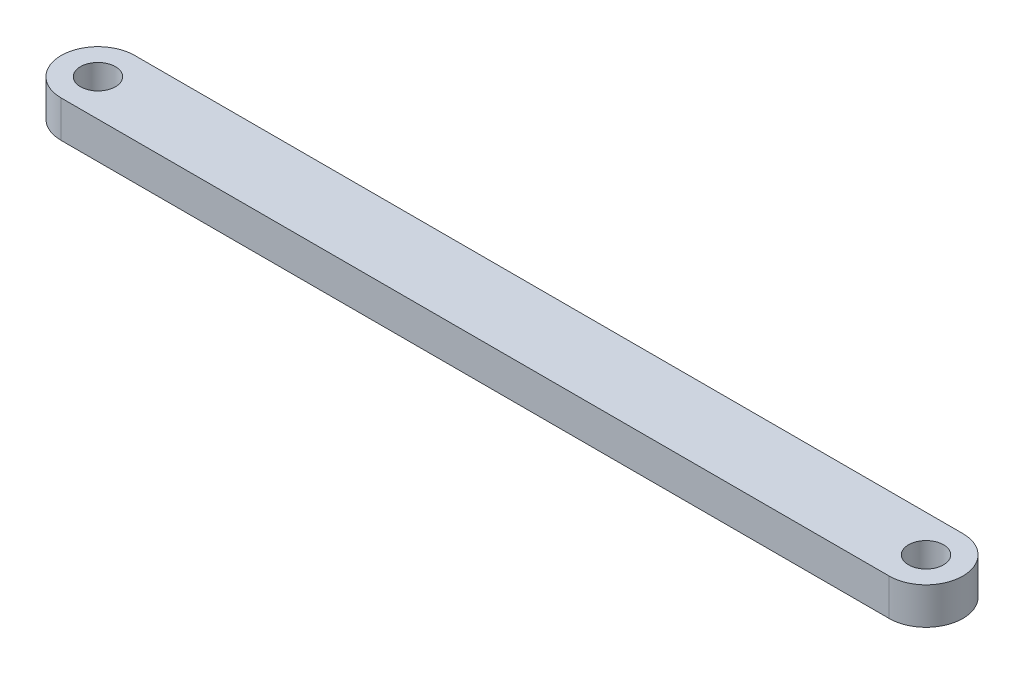
ISO-10303-21;
HEADER;
FILE_DESCRIPTION(('STEP AP214'),'2;1');
FILE_NAME('part.step','',(''),(''),'','','');
FILE_SCHEMA(('AUTOMOTIVE_DESIGN { 1 0 10303 214 1 1 1 1 }'));
ENDSEC;
DATA;
#1=APPLICATION_CONTEXT('core data for automotive mechanical design processes');
#2=APPLICATION_PROTOCOL_DEFINITION('international standard','automotive_design',2000,#1);
#3=PRODUCT_CONTEXT('',#1,'mechanical');
#4=PRODUCT('Part','Part','',(#3));
#5=PRODUCT_RELATED_PRODUCT_CATEGORY('part','',(#4));
#6=PRODUCT_DEFINITION_FORMATION('','',#4);
#7=PRODUCT_DEFINITION_CONTEXT('part definition',#1,'design');
#8=PRODUCT_DEFINITION('design','',#6,#7);
#9=PRODUCT_DEFINITION_SHAPE('','',#8);
#10=(LENGTH_UNIT() NAMED_UNIT(*) SI_UNIT(.MILLI.,.METRE.));
#11=(NAMED_UNIT(*) PLANE_ANGLE_UNIT() SI_UNIT($,.RADIAN.));
#12=(NAMED_UNIT(*) SI_UNIT($,.STERADIAN.) SOLID_ANGLE_UNIT());
#13=UNCERTAINTY_MEASURE_WITH_UNIT(LENGTH_MEASURE(1.E-05),#10,'distance_accuracy_value','');
#14=(GEOMETRIC_REPRESENTATION_CONTEXT(3) GLOBAL_UNCERTAINTY_ASSIGNED_CONTEXT((#13)) GLOBAL_UNIT_ASSIGNED_CONTEXT((#10,
#11,#12)) REPRESENTATION_CONTEXT('',''));
#15=CARTESIAN_POINT('',(0.,0.,0.));
#16=DIRECTION('',(0.,0.,1.));
#17=DIRECTION('',(1.,0.,0.));
#18=AXIS2_PLACEMENT_3D('',#15,#16,#17);
#19=CARTESIAN_POINT('',(22.5,1.,0.));
#20=DIRECTION('',(0.,1.,0.));
#21=DIRECTION('',(0.,0.,1.));
#22=AXIS2_PLACEMENT_3D('',#19,#20,#21);
#23=PLANE('',#22);
#24=CARTESIAN_POINT('',(-22.5,1.,0.));
#25=DIRECTION('',(0.,1.,0.));
#26=DIRECTION('',(0.,0.,1.));
#27=AXIS2_PLACEMENT_3D('',#24,#25,#26);
#28=CIRCLE('',#27,0.950000000000001);
#29=CARTESIAN_POINT('',(-22.5,1.,0.950000000000006));
#30=VERTEX_POINT('',#29);
#31=EDGE_CURVE('E104',#30,#30,#28,.T.);
#32=ORIENTED_EDGE('',*,*,#31,.F.);
#33=EDGE_LOOP('',(#32));
#34=FACE_BOUND('',#33,.T.);
#35=CARTESIAN_POINT('',(22.5,1.,0.));
#36=DIRECTION('',(0.,1.,0.));
#37=DIRECTION('',(0.,0.,1.));
#38=AXIS2_PLACEMENT_3D('',#35,#36,#37);
#39=CIRCLE('',#38,2.);
#40=CARTESIAN_POINT('',(22.5,1.,1.99999999999999));
#41=VERTEX_POINT('',#40);
#42=CARTESIAN_POINT('',(22.5,1.,-2.00000000000001));
#43=VERTEX_POINT('',#42);
#44=EDGE_CURVE('E89',#41,#43,#39,.T.);
#45=ORIENTED_EDGE('',*,*,#44,.T.);
#46=DIRECTION('',(-1.,0.,0.));
#47=VECTOR('',#46,1.);
#48=CARTESIAN_POINT('',(22.5,1.,-2.00000000000001));
#49=LINE('',#48,#47);
#50=CARTESIAN_POINT('',(-22.5,1.,-1.99999999999999));
#51=VERTEX_POINT('',#50);
#52=EDGE_CURVE('E84',#43,#51,#49,.T.);
#53=ORIENTED_EDGE('',*,*,#52,.T.);
#54=CARTESIAN_POINT('',(-22.5,1.,0.));
#55=DIRECTION('',(0.,1.,0.));
#56=DIRECTION('',(0.,0.,1.));
#57=AXIS2_PLACEMENT_3D('',#54,#55,#56);
#58=CIRCLE('',#57,2.);
#59=CARTESIAN_POINT('',(-22.5,1.,2.00000000000001));
#60=VERTEX_POINT('',#59);
#61=EDGE_CURVE('E87',#51,#60,#58,.T.);
#62=ORIENTED_EDGE('',*,*,#61,.T.);
#63=DIRECTION('',(1.,0.,0.));
#64=VECTOR('',#63,1.);
#65=CARTESIAN_POINT('',(22.5,1.,1.99999999999999));
#66=LINE('',#65,#64);
#67=EDGE_CURVE('E54',#60,#41,#66,.T.);
#68=ORIENTED_EDGE('',*,*,#67,.T.);
#69=EDGE_LOOP('',(#45,#53,#62,#68));
#70=FACE_BOUND('',#69,.T.);
#71=CARTESIAN_POINT('',(22.5,1.,0.));
#72=DIRECTION('',(0.,1.,0.));
#73=DIRECTION('',(0.,0.,1.));
#74=AXIS2_PLACEMENT_3D('',#71,#72,#73);
#75=CIRCLE('',#74,0.950000000000001);
#76=CARTESIAN_POINT('',(22.5,1.,0.949999999999992));
#77=VERTEX_POINT('',#76);
#78=EDGE_CURVE('E119',#77,#77,#75,.T.);
#79=ORIENTED_EDGE('',*,*,#78,.F.);
#80=EDGE_LOOP('',(#79));
#81=FACE_BOUND('',#80,.T.);
#82=ADVANCED_FACE('F37',(#34,#70,#81),#23,.T.);
#83=CARTESIAN_POINT('',(22.5,-1.,0.));
#84=DIRECTION('',(0.,1.,0.));
#85=DIRECTION('',(0.,0.,1.));
#86=AXIS2_PLACEMENT_3D('',#83,#84,#85);
#87=PLANE('',#86);
#88=CARTESIAN_POINT('',(22.5,-1.,0.));
#89=DIRECTION('',(0.,1.,0.));
#90=DIRECTION('',(0.,0.,1.));
#91=AXIS2_PLACEMENT_3D('',#88,#89,#90);
#92=CIRCLE('',#91,2.);
#93=CARTESIAN_POINT('',(22.5,-1.,1.99999999999999));
#94=VERTEX_POINT('',#93);
#95=CARTESIAN_POINT('',(22.5,-1.,-2.00000000000001));
#96=VERTEX_POINT('',#95);
#97=EDGE_CURVE('E101',#94,#96,#92,.T.);
#98=ORIENTED_EDGE('',*,*,#97,.F.);
#99=DIRECTION('',(1.,0.,0.));
#100=VECTOR('',#99,1.);
#101=CARTESIAN_POINT('',(22.5,-1.,1.99999999999999));
#102=LINE('',#101,#100);
#103=CARTESIAN_POINT('',(-22.5,-1.,2.00000000000001));
#104=VERTEX_POINT('',#103);
#105=EDGE_CURVE('E77',#104,#94,#102,.T.);
#106=ORIENTED_EDGE('',*,*,#105,.F.);
#107=CARTESIAN_POINT('',(-22.5,-1.,0.));
#108=DIRECTION('',(0.,1.,0.));
#109=DIRECTION('',(0.,0.,1.));
#110=AXIS2_PLACEMENT_3D('',#107,#108,#109);
#111=CIRCLE('',#110,2.);
#112=CARTESIAN_POINT('',(-22.5,-1.,-1.99999999999999));
#113=VERTEX_POINT('',#112);
#114=EDGE_CURVE('E71',#113,#104,#111,.T.);
#115=ORIENTED_EDGE('',*,*,#114,.F.);
#116=DIRECTION('',(-1.,0.,0.));
#117=VECTOR('',#116,1.);
#118=CARTESIAN_POINT('',(22.5,-1.,-2.00000000000001));
#119=LINE('',#118,#117);
#120=EDGE_CURVE('E93',#96,#113,#119,.T.);
#121=ORIENTED_EDGE('',*,*,#120,.F.);
#122=EDGE_LOOP('',(#98,#106,#115,#121));
#123=FACE_BOUND('',#122,.T.);
#124=CARTESIAN_POINT('',(-22.5,-1.,0.));
#125=DIRECTION('',(0.,1.,0.));
#126=DIRECTION('',(0.,0.,1.));
#127=AXIS2_PLACEMENT_3D('',#124,#125,#126);
#128=CIRCLE('',#127,0.950000000000001);
#129=CARTESIAN_POINT('',(-22.5,-1.,0.950000000000006));
#130=VERTEX_POINT('',#129);
#131=EDGE_CURVE('E116',#130,#130,#128,.T.);
#132=ORIENTED_EDGE('',*,*,#131,.T.);
#133=EDGE_LOOP('',(#132));
#134=FACE_BOUND('',#133,.T.);
#135=CARTESIAN_POINT('',(22.5,-1.,0.));
#136=DIRECTION('',(0.,1.,0.));
#137=DIRECTION('',(0.,0.,1.));
#138=AXIS2_PLACEMENT_3D('',#135,#136,#137);
#139=CIRCLE('',#138,0.950000000000001);
#140=CARTESIAN_POINT('',(22.5,-1.,0.949999999999992));
#141=VERTEX_POINT('',#140);
#142=EDGE_CURVE('E122',#141,#141,#139,.T.);
#143=ORIENTED_EDGE('',*,*,#142,.T.);
#144=EDGE_LOOP('',(#143));
#145=FACE_BOUND('',#144,.T.);
#146=ADVANCED_FACE('F112',(#123,#134,#145),#87,.F.);
#147=CARTESIAN_POINT('',(22.5,1.,0.));
#148=DIRECTION('',(0.,-1.,0.));
#149=DIRECTION('',(0.,0.,-1.));
#150=AXIS2_PLACEMENT_3D('',#147,#148,#149);
#151=CYLINDRICAL_SURFACE('',#150,2.);
#152=ORIENTED_EDGE('',*,*,#97,.T.);
#153=DIRECTION('',(0.,-1.,0.));
#154=VECTOR('',#153,1.);
#155=CARTESIAN_POINT('',(22.5,1.,-2.00000000000001));
#156=LINE('',#155,#154);
#157=EDGE_CURVE('E11',#43,#96,#156,.T.);
#158=ORIENTED_EDGE('',*,*,#157,.F.);
#159=ORIENTED_EDGE('',*,*,#44,.F.);
#160=DIRECTION('',(0.,-1.,0.));
#161=VECTOR('',#160,1.);
#162=CARTESIAN_POINT('',(22.5,1.,1.99999999999999));
#163=LINE('',#162,#161);
#164=EDGE_CURVE('E97',#41,#94,#163,.T.);
#165=ORIENTED_EDGE('',*,*,#164,.T.);
#166=EDGE_LOOP('',(#152,#158,#159,#165));
#167=FACE_BOUND('',#166,.T.);
#168=ADVANCED_FACE('F39',(#167),#151,.T.);
#169=CARTESIAN_POINT('',(22.5,1.,-2.00000000000001));
#170=DIRECTION('',(0.,0.,1.));
#171=DIRECTION('',(1.,0.,0.));
#172=AXIS2_PLACEMENT_3D('',#169,#170,#171);
#173=PLANE('',#172);
#174=ORIENTED_EDGE('',*,*,#120,.T.);
#175=DIRECTION('',(0.,-1.,0.));
#176=VECTOR('',#175,1.);
#177=CARTESIAN_POINT('',(-22.5,1.,-1.99999999999999));
#178=LINE('',#177,#176);
#179=EDGE_CURVE('E46',#51,#113,#178,.T.);
#180=ORIENTED_EDGE('',*,*,#179,.F.);
#181=ORIENTED_EDGE('',*,*,#52,.F.);
#182=ORIENTED_EDGE('',*,*,#157,.T.);
#183=EDGE_LOOP('',(#174,#180,#181,#182));
#184=FACE_BOUND('',#183,.T.);
#185=ADVANCED_FACE('F92',(#184),#173,.F.);
#186=CARTESIAN_POINT('',(-22.5,1.,0.));
#187=DIRECTION('',(0.,-1.,0.));
#188=DIRECTION('',(0.,0.,-1.));
#189=AXIS2_PLACEMENT_3D('',#186,#187,#188);
#190=CYLINDRICAL_SURFACE('',#189,2.);
#191=ORIENTED_EDGE('',*,*,#114,.T.);
#192=DIRECTION('',(0.,-1.,0.));
#193=VECTOR('',#192,1.);
#194=CARTESIAN_POINT('',(-22.5,1.,2.00000000000001));
#195=LINE('',#194,#193);
#196=EDGE_CURVE('E94',#60,#104,#195,.T.);
#197=ORIENTED_EDGE('',*,*,#196,.F.);
#198=ORIENTED_EDGE('',*,*,#61,.F.);
#199=ORIENTED_EDGE('',*,*,#179,.T.);
#200=EDGE_LOOP('',(#191,#197,#198,#199));
#201=FACE_BOUND('',#200,.T.);
#202=ADVANCED_FACE('F95',(#201),#190,.T.);
#203=CARTESIAN_POINT('',(22.5,1.,1.99999999999999));
#204=DIRECTION('',(0.,0.,-1.));
#205=DIRECTION('',(-1.,0.,0.));
#206=AXIS2_PLACEMENT_3D('',#203,#204,#205);
#207=PLANE('',#206);
#208=ORIENTED_EDGE('',*,*,#105,.T.);
#209=ORIENTED_EDGE('',*,*,#164,.F.);
#210=ORIENTED_EDGE('',*,*,#67,.F.);
#211=ORIENTED_EDGE('',*,*,#196,.T.);
#212=EDGE_LOOP('',(#208,#209,#210,#211));
#213=FACE_BOUND('',#212,.T.);
#214=ADVANCED_FACE('F109',(#213),#207,.F.);
#215=CARTESIAN_POINT('',(-22.5,1.,0.));
#216=DIRECTION('',(0.,-1.,0.));
#217=DIRECTION('',(0.,0.,-1.));
#218=AXIS2_PLACEMENT_3D('',#215,#216,#217);
#219=CYLINDRICAL_SURFACE('',#218,0.950000000000001);
#220=ORIENTED_EDGE('',*,*,#31,.T.);
#221=EDGE_LOOP('',(#220));
#222=FACE_BOUND('',#221,.T.);
#223=ORIENTED_EDGE('',*,*,#131,.F.);
#224=EDGE_LOOP('',(#223));
#225=FACE_BOUND('',#224,.T.);
#226=ADVANCED_FACE('F139',(#222,#225),#219,.F.);
#227=CARTESIAN_POINT('',(22.5,1.,0.));
#228=DIRECTION('',(0.,-1.,0.));
#229=DIRECTION('',(0.,0.,-1.));
#230=AXIS2_PLACEMENT_3D('',#227,#228,#229);
#231=CYLINDRICAL_SURFACE('',#230,0.950000000000001);
#232=ORIENTED_EDGE('',*,*,#78,.T.);
#233=EDGE_LOOP('',(#232));
#234=FACE_BOUND('',#233,.T.);
#235=ORIENTED_EDGE('',*,*,#142,.F.);
#236=EDGE_LOOP('',(#235));
#237=FACE_BOUND('',#236,.T.);
#238=ADVANCED_FACE('F128',(#234,#237),#231,.F.);
#239=CLOSED_SHELL('',(#82,#146,#168,#185,#202,#214,#226,#238));
#240=MANIFOLD_SOLID_BREP('B2',#239);
#241=ADVANCED_BREP_SHAPE_REPRESENTATION('',(#18,#240),#14);
#242=SHAPE_DEFINITION_REPRESENTATION(#9,#241);
ENDSEC;
END-ISO-10303-21;
